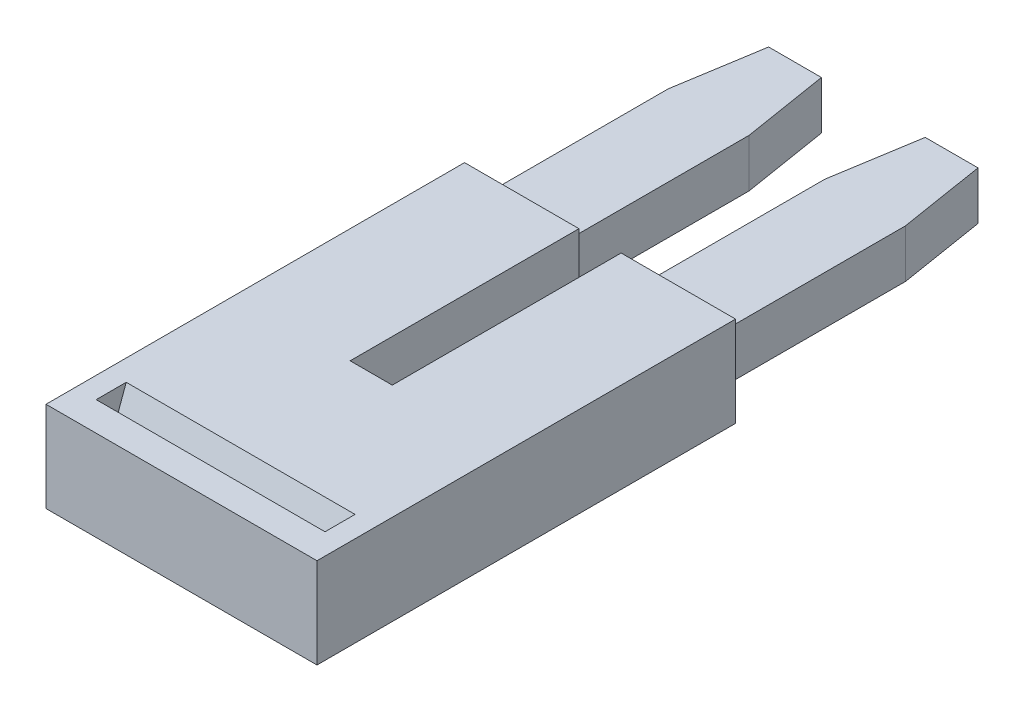
ISO-10303-21;
HEADER;
FILE_DESCRIPTION(('STEP AP214'),'2;1');
FILE_NAME('part.step','',(''),(''),'','','');
FILE_SCHEMA(('AUTOMOTIVE_DESIGN { 1 0 10303 214 1 1 1 1 }'));
ENDSEC;
DATA;
#1=APPLICATION_CONTEXT('core data for automotive mechanical design processes');
#2=APPLICATION_PROTOCOL_DEFINITION('international standard','automotive_design',2000,#1);
#3=PRODUCT_CONTEXT('',#1,'mechanical');
#4=PRODUCT('Part','Part','',(#3));
#5=PRODUCT_RELATED_PRODUCT_CATEGORY('part','',(#4));
#6=PRODUCT_DEFINITION_FORMATION('','',#4);
#7=PRODUCT_DEFINITION_CONTEXT('part definition',#1,'design');
#8=PRODUCT_DEFINITION('design','',#6,#7);
#9=PRODUCT_DEFINITION_SHAPE('','',#8);
#10=(LENGTH_UNIT() NAMED_UNIT(*) SI_UNIT(.MILLI.,.METRE.));
#11=(NAMED_UNIT(*) PLANE_ANGLE_UNIT() SI_UNIT($,.RADIAN.));
#12=(NAMED_UNIT(*) SI_UNIT($,.STERADIAN.) SOLID_ANGLE_UNIT());
#13=UNCERTAINTY_MEASURE_WITH_UNIT(LENGTH_MEASURE(1.E-05),#10,'distance_accuracy_value','');
#14=(GEOMETRIC_REPRESENTATION_CONTEXT(3) GLOBAL_UNCERTAINTY_ASSIGNED_CONTEXT((#13)) GLOBAL_UNIT_ASSIGNED_CONTEXT((#10,
#11,#12)) REPRESENTATION_CONTEXT('',''));
#15=CARTESIAN_POINT('',(0.,0.,0.));
#16=DIRECTION('',(0.,0.,1.));
#17=DIRECTION('',(1.,0.,0.));
#18=AXIS2_PLACEMENT_3D('',#15,#16,#17);
#19=CARTESIAN_POINT('',(-1.4200024,1.,21.3750000022971));
#20=DIRECTION('',(0.,0.342020143325669,-0.939692620785908));
#21=DIRECTION('',(-1.,0.,0.));
#22=AXIS2_PLACEMENT_3D('',#19,#20,#21);
#23=PLANE('',#22);
#24=DIRECTION('',(1.,0.,0.));
#25=VECTOR('',#24,1.);
#26=CARTESIAN_POINT('',(11.2850159999987,1.,21.3750000022971));
#27=LINE('',#26,#25);
#28=CARTESIAN_POINT('',(0.7,1.,21.3750000022971));
#29=VERTEX_POINT('',#28);
#30=CARTESIAN_POINT('',(8.3,1.,21.3750000022971));
#31=VERTEX_POINT('',#30);
#32=EDGE_CURVE('E11',#29,#31,#27,.T.);
#33=ORIENTED_EDGE('',*,*,#32,.F.);
#34=DIRECTION('',(0.,-0.939692620785908,-0.342020143325669));
#35=VECTOR('',#34,1.);
#36=CARTESIAN_POINT('',(0.7,0.,21.0110297680308));
#37=LINE('',#36,#35);
#38=CARTESIAN_POINT('',(0.7,0.,21.0110297680308));
#39=VERTEX_POINT('',#38);
#40=EDGE_CURVE('E367',#29,#39,#37,.T.);
#41=ORIENTED_EDGE('',*,*,#40,.T.);
#42=DIRECTION('',(-1.,0.,0.));
#43=VECTOR('',#42,1.);
#44=CARTESIAN_POINT('',(-2.2850159999988,0.,21.0110297680308));
#45=LINE('',#44,#43);
#46=CARTESIAN_POINT('',(8.3,0.,21.0110297680308));
#47=VERTEX_POINT('',#46);
#48=EDGE_CURVE('E392',#47,#39,#45,.T.);
#49=ORIENTED_EDGE('',*,*,#48,.F.);
#50=DIRECTION('',(0.,-0.939692620785908,-0.342020143325669));
#51=VECTOR('',#50,1.);
#52=CARTESIAN_POINT('',(8.3,0.,21.0110297680308));
#53=LINE('',#52,#51);
#54=EDGE_CURVE('E514',#31,#47,#53,.T.);
#55=ORIENTED_EDGE('',*,*,#54,.F.);
#56=EDGE_LOOP('',(#33,#41,#49,#55));
#57=FACE_BOUND('',#56,.T.);
#58=ADVANCED_FACE('F17',(#57),#23,.F.);
#59=CARTESIAN_POINT('',(3.7799976,1.,21.7410254060815));
#60=DIRECTION('',(0.,1.,0.));
#61=DIRECTION('',(0.,0.,1.));
#62=AXIS2_PLACEMENT_3D('',#59,#60,#61);
#63=PLANE('',#62);
#64=DIRECTION('',(1.,0.,0.));
#65=VECTOR('',#64,1.);
#66=CARTESIAN_POINT('',(11.2850159999987,1.,21.7410254060815));
#67=LINE('',#66,#65);
#68=CARTESIAN_POINT('',(0.7,1.,21.7410254060815));
#69=VERTEX_POINT('',#68);
#70=CARTESIAN_POINT('',(8.3,1.,21.7410254060815));
#71=VERTEX_POINT('',#70);
#72=EDGE_CURVE('E341',#69,#71,#67,.T.);
#73=ORIENTED_EDGE('',*,*,#72,.F.);
#74=DIRECTION('',(0.,0.,1.));
#75=VECTOR('',#74,1.);
#76=CARTESIAN_POINT('',(0.7,0.999999999999986,19.5448760022974));
#77=LINE('',#76,#75);
#78=EDGE_CURVE('E28',#29,#69,#77,.T.);
#79=ORIENTED_EDGE('',*,*,#78,.F.);
#80=ORIENTED_EDGE('',*,*,#32,.T.);
#81=DIRECTION('',(0.,0.,-1.));
#82=VECTOR('',#81,1.);
#83=CARTESIAN_POINT('',(8.3,0.999999999999985,19.5448760022974));
#84=LINE('',#83,#82);
#85=EDGE_CURVE('E418',#71,#31,#84,.T.);
#86=ORIENTED_EDGE('',*,*,#85,.F.);
#87=EDGE_LOOP('',(#73,#79,#80,#86));
#88=FACE_BOUND('',#87,.T.);
#89=ADVANCED_FACE('F597',(#88),#63,.F.);
#90=CARTESIAN_POINT('',(0.7,0.905897704359139,16.548236049703));
#91=DIRECTION('',(-1.,0.,0.));
#92=DIRECTION('',(0.,-1.,1.26010313294955E-13));
#93=AXIS2_PLACEMENT_3D('',#90,#91,#92);
#94=PLANE('',#93);
#95=ORIENTED_EDGE('',*,*,#40,.F.);
#96=ORIENTED_EDGE('',*,*,#78,.T.);
#97=DIRECTION('',(0.,0.965925826289069,-0.25881904510252));
#98=VECTOR('',#97,1.);
#99=CARTESIAN_POINT('',(0.7,0.,22.0089745985125));
#100=LINE('',#99,#98);
#101=CARTESIAN_POINT('',(0.7,0.,22.0089745985125));
#102=VERTEX_POINT('',#101);
#103=EDGE_CURVE('E331',#102,#69,#100,.T.);
#104=ORIENTED_EDGE('',*,*,#103,.F.);
#105=DIRECTION('',(0.,0.,1.));
#106=VECTOR('',#105,1.);
#107=CARTESIAN_POINT('',(0.7,0.,19.8448760022976));
#108=LINE('',#107,#106);
#109=EDGE_CURVE('E384',#39,#102,#108,.T.);
#110=ORIENTED_EDGE('',*,*,#109,.F.);
#111=EDGE_LOOP('',(#95,#96,#104,#110));
#112=FACE_BOUND('',#111,.T.);
#113=ADVANCED_FACE('F19',(#112),#94,.F.);
#114=CARTESIAN_POINT('',(8.3,1.61850495487346,14.0928490765419));
#115=DIRECTION('',(1.,0.,0.));
#116=DIRECTION('',(0.,1.,-1.26010313294955E-13));
#117=AXIS2_PLACEMENT_3D('',#114,#115,#116);
#118=PLANE('',#117);
#119=DIRECTION('',(0.,-0.965925826289069,0.25881904510252));
#120=VECTOR('',#119,1.);
#121=CARTESIAN_POINT('',(8.3,0.,22.0089745985125));
#122=LINE('',#121,#120);
#123=CARTESIAN_POINT('',(8.3,0.,22.0089745985125));
#124=VERTEX_POINT('',#123);
#125=EDGE_CURVE('E416',#71,#124,#122,.T.);
#126=ORIENTED_EDGE('',*,*,#125,.F.);
#127=ORIENTED_EDGE('',*,*,#85,.T.);
#128=ORIENTED_EDGE('',*,*,#54,.T.);
#129=DIRECTION('',(0.,0.,-1.));
#130=VECTOR('',#129,1.);
#131=CARTESIAN_POINT('',(8.3,0.,19.8448760022976));
#132=LINE('',#131,#130);
#133=EDGE_CURVE('E383',#124,#47,#132,.T.);
#134=ORIENTED_EDGE('',*,*,#133,.F.);
#135=EDGE_LOOP('',(#126,#127,#128,#134));
#136=FACE_BOUND('',#135,.T.);
#137=ADVANCED_FACE('F635',(#136),#118,.F.);
#138=CARTESIAN_POINT('',(-1.4200024,0.5,21.875000002297));
#139=DIRECTION('',(0.,0.25881904510252,0.965925826289069));
#140=DIRECTION('',(-1.,0.,0.));
#141=AXIS2_PLACEMENT_3D('',#138,#139,#140);
#142=PLANE('',#141);
#143=ORIENTED_EDGE('',*,*,#103,.T.);
#144=ORIENTED_EDGE('',*,*,#72,.T.);
#145=ORIENTED_EDGE('',*,*,#125,.T.);
#146=DIRECTION('',(1.,0.,0.));
#147=VECTOR('',#146,1.);
#148=CARTESIAN_POINT('',(-2.2850159999988,0.,22.0089745985125));
#149=LINE('',#148,#147);
#150=EDGE_CURVE('E380',#102,#124,#149,.T.);
#151=ORIENTED_EDGE('',*,*,#150,.F.);
#152=EDGE_LOOP('',(#143,#144,#145,#151));
#153=FACE_BOUND('',#152,.T.);
#154=ADVANCED_FACE('F638',(#153),#142,.F.);
#155=CARTESIAN_POINT('',(8.3,1.61850495487346,14.0928490765419));
#156=DIRECTION('',(1.,0.,0.));
#157=DIRECTION('',(0.,1.,-1.26010313294955E-13));
#158=AXIS2_PLACEMENT_3D('',#155,#156,#157);
#159=PLANE('',#158);
#160=DIRECTION('',(0.,0.939692620785908,-0.342020143325669));
#161=VECTOR('',#160,1.);
#162=CARTESIAN_POINT('',(8.3,0.,22.1029404708293));
#163=LINE('',#162,#161);
#164=CARTESIAN_POINT('',(8.3,2.,21.375000002297));
#165=VERTEX_POINT('',#164);
#166=CARTESIAN_POINT('',(8.3,3.,21.0110297680308));
#167=VERTEX_POINT('',#166);
#168=EDGE_CURVE('E318',#165,#167,#163,.T.);
#169=ORIENTED_EDGE('',*,*,#168,.F.);
#170=DIRECTION('',(0.,0.,1.));
#171=VECTOR('',#170,1.);
#172=CARTESIAN_POINT('',(8.3,2.,19.5448760022974));
#173=LINE('',#172,#171);
#174=CARTESIAN_POINT('',(8.3,2.,21.7410254060814));
#175=VERTEX_POINT('',#174);
#176=EDGE_CURVE('E328',#165,#175,#173,.T.);
#177=ORIENTED_EDGE('',*,*,#176,.T.);
#178=DIRECTION('',(0.,-0.965925826289069,-0.25881904510252));
#179=VECTOR('',#178,1.);
#180=CARTESIAN_POINT('',(8.3,0.,21.2051270212191));
#181=LINE('',#180,#179);
#182=CARTESIAN_POINT('',(8.3,3.,22.0089745985126));
#183=VERTEX_POINT('',#182);
#184=EDGE_CURVE('E313',#183,#175,#181,.T.);
#185=ORIENTED_EDGE('',*,*,#184,.F.);
#186=DIRECTION('',(0.,0.,-1.));
#187=VECTOR('',#186,1.);
#188=CARTESIAN_POINT('',(8.3,3.,19.8448760022972));
#189=LINE('',#188,#187);
#190=EDGE_CURVE('E332',#183,#167,#189,.T.);
#191=ORIENTED_EDGE('',*,*,#190,.T.);
#192=EDGE_LOOP('',(#169,#177,#185,#191));
#193=FACE_BOUND('',#192,.T.);
#194=ADVANCED_FACE('F963',(#193),#159,.F.);
#195=CARTESIAN_POINT('',(-6.6200024,2.,21.6094970022974));
#196=DIRECTION('',(0.,-1.,0.));
#197=DIRECTION('',(0.,0.,1.));
#198=AXIS2_PLACEMENT_3D('',#195,#196,#197);
#199=PLANE('',#198);
#200=DIRECTION('',(-1.,0.,0.));
#201=VECTOR('',#200,1.);
#202=CARTESIAN_POINT('',(11.2850159999987,2.,21.7410254060814));
#203=LINE('',#202,#201);
#204=CARTESIAN_POINT('',(0.7,2.,21.7410254060814));
#205=VERTEX_POINT('',#204);
#206=EDGE_CURVE('E317',#175,#205,#203,.T.);
#207=ORIENTED_EDGE('',*,*,#206,.F.);
#208=ORIENTED_EDGE('',*,*,#176,.F.);
#209=DIRECTION('',(-1.,0.,0.));
#210=VECTOR('',#209,1.);
#211=CARTESIAN_POINT('',(11.2850159999987,2.,21.375000002297));
#212=LINE('',#211,#210);
#213=CARTESIAN_POINT('',(0.7,2.,21.375000002297));
#214=VERTEX_POINT('',#213);
#215=EDGE_CURVE('E324',#165,#214,#212,.T.);
#216=ORIENTED_EDGE('',*,*,#215,.T.);
#217=DIRECTION('',(0.,0.,1.));
#218=VECTOR('',#217,1.);
#219=CARTESIAN_POINT('',(0.7,2.,19.5448760022974));
#220=LINE('',#219,#218);
#221=EDGE_CURVE('E500',#214,#205,#220,.T.);
#222=ORIENTED_EDGE('',*,*,#221,.T.);
#223=EDGE_LOOP('',(#207,#208,#216,#222));
#224=FACE_BOUND('',#223,.T.);
#225=ADVANCED_FACE('F973',(#224),#199,.F.);
#226=CARTESIAN_POINT('',(7.7799976,2.,21.7410254060814));
#227=DIRECTION('',(0.,-0.25881904510252,0.965925826289069));
#228=DIRECTION('',(1.,0.,0.));
#229=AXIS2_PLACEMENT_3D('',#226,#227,#228);
#230=PLANE('',#229);
#231=DIRECTION('',(0.,0.965925826289069,0.25881904510252));
#232=VECTOR('',#231,1.);
#233=CARTESIAN_POINT('',(0.7,0.,21.2051270212191));
#234=LINE('',#233,#232);
#235=CARTESIAN_POINT('',(0.7,3.,22.0089745985126));
#236=VERTEX_POINT('',#235);
#237=EDGE_CURVE('E311',#205,#236,#234,.T.);
#238=ORIENTED_EDGE('',*,*,#237,.T.);
#239=DIRECTION('',(1.,0.,0.));
#240=VECTOR('',#239,1.);
#241=CARTESIAN_POINT('',(-2.2850159999988,3.,22.0089745985126));
#242=LINE('',#241,#240);
#243=EDGE_CURVE('E336',#236,#183,#242,.T.);
#244=ORIENTED_EDGE('',*,*,#243,.T.);
#245=ORIENTED_EDGE('',*,*,#184,.T.);
#246=ORIENTED_EDGE('',*,*,#206,.T.);
#247=EDGE_LOOP('',(#238,#244,#245,#246));
#248=FACE_BOUND('',#247,.T.);
#249=ADVANCED_FACE('F605',(#248),#230,.F.);
#250=CARTESIAN_POINT('',(3.7799976,3.42381598447616,20.8567733648752));
#251=DIRECTION('',(0.,-0.342020143325669,-0.939692620785908));
#252=DIRECTION('',(0.,-0.939692620785908,0.342020143325669));
#253=AXIS2_PLACEMENT_3D('',#250,#251,#252);
#254=PLANE('',#253);
#255=DIRECTION('',(-1.,0.,0.));
#256=VECTOR('',#255,1.);
#257=CARTESIAN_POINT('',(-2.2850159999988,3.,21.0110297680308));
#258=LINE('',#257,#256);
#259=CARTESIAN_POINT('',(0.7,3.,21.0110297680308));
#260=VERTEX_POINT('',#259);
#261=EDGE_CURVE('E372',#167,#260,#258,.T.);
#262=ORIENTED_EDGE('',*,*,#261,.T.);
#263=DIRECTION('',(0.,-0.939692620785908,0.342020143325669));
#264=VECTOR('',#263,1.);
#265=CARTESIAN_POINT('',(0.7,0.,22.1029404708293));
#266=LINE('',#265,#264);
#267=EDGE_CURVE('E327',#260,#214,#266,.T.);
#268=ORIENTED_EDGE('',*,*,#267,.T.);
#269=ORIENTED_EDGE('',*,*,#215,.F.);
#270=ORIENTED_EDGE('',*,*,#168,.T.);
#271=EDGE_LOOP('',(#262,#268,#269,#270));
#272=FACE_BOUND('',#271,.T.);
#273=ADVANCED_FACE('F630',(#272),#254,.F.);
#274=CARTESIAN_POINT('',(0.7,7.05810522166591,22.675000002297));
#275=DIRECTION('',(-1.,0.,0.));
#276=DIRECTION('',(0.,-1.,1.26010313294955E-13));
#277=AXIS2_PLACEMENT_3D('',#274,#275,#276);
#278=PLANE('',#277);
#279=ORIENTED_EDGE('',*,*,#237,.F.);
#280=ORIENTED_EDGE('',*,*,#221,.F.);
#281=ORIENTED_EDGE('',*,*,#267,.F.);
#282=DIRECTION('',(0.,0.,1.));
#283=VECTOR('',#282,1.);
#284=CARTESIAN_POINT('',(0.7,3.,19.8448760022972));
#285=LINE('',#284,#283);
#286=EDGE_CURVE('E368',#260,#236,#285,.T.);
#287=ORIENTED_EDGE('',*,*,#286,.T.);
#288=EDGE_LOOP('',(#279,#280,#281,#287));
#289=FACE_BOUND('',#288,.T.);
#290=ADVANCED_FACE('F633',(#289),#278,.F.);
#291=CARTESIAN_POINT('',(2.3510536313107,0.699999999990223,-2.20268248085631E-13));
#292=DIRECTION('',(-1.44485161757993E-13,0.,1.));
#293=DIRECTION('',(-1.,0.,-1.44485161757993E-13));
#294=AXIS2_PLACEMENT_3D('',#291,#292,#293);
#295=PLANE('',#294);
#296=DIRECTION('',(0.,-1.,0.));
#297=VECTOR('',#296,1.);
#298=CARTESIAN_POINT('',(1.0231890513662,0.699999999990223,-4.19220214098459E-13));
#299=LINE('',#298,#297);
#300=CARTESIAN_POINT('',(1.0231890513662,2.29999999999022,-4.19220214098459E-13));
#301=VERTEX_POINT('',#300);
#302=CARTESIAN_POINT('',(1.0231890513662,0.699999999990223,-4.19220214098459E-13));
#303=VERTEX_POINT('',#302);
#304=EDGE_CURVE('E308',#301,#303,#299,.T.);
#305=ORIENTED_EDGE('',*,*,#304,.F.);
#306=DIRECTION('',(1.,0.,1.44485161757993E-13));
#307=VECTOR('',#306,1.);
#308=CARTESIAN_POINT('',(4.1002658398157,2.29999999999022,2.29208296786964E-09));
#309=LINE('',#308,#307);
#310=CARTESIAN_POINT('',(2.7768109480402,2.29999999999022,-2.20268248085631E-13));
#311=VERTEX_POINT('',#310);
#312=EDGE_CURVE('E307',#301,#311,#309,.T.);
#313=ORIENTED_EDGE('',*,*,#312,.T.);
#314=DIRECTION('',(0.,-1.,0.));
#315=VECTOR('',#314,1.);
#316=CARTESIAN_POINT('',(2.7768109480402,0.699999999990223,-2.20268248085631E-13));
#317=LINE('',#316,#315);
#318=CARTESIAN_POINT('',(2.7768109480402,0.699999999990223,-2.20268248085631E-13));
#319=VERTEX_POINT('',#318);
#320=EDGE_CURVE('E312',#311,#319,#317,.T.);
#321=ORIENTED_EDGE('',*,*,#320,.T.);
#322=DIRECTION('',(1.,0.,1.44485161757993E-13));
#323=VECTOR('',#322,1.);
#324=CARTESIAN_POINT('',(4.1002658398157,0.699999999990223,2.29208296786964E-09));
#325=LINE('',#324,#323);
#326=EDGE_CURVE('E408',#303,#319,#325,.T.);
#327=ORIENTED_EDGE('',*,*,#326,.F.);
#328=EDGE_LOOP('',(#305,#313,#321,#327));
#329=FACE_BOUND('',#328,.T.);
#330=ADVANCED_FACE('F578',(#329),#295,.F.);
#331=CARTESIAN_POINT('',(0.955336778672901,0.699999999990226,0.420315790585686));
#332=DIRECTION('',(0.987219178105449,0.,0.159368423411923));
#333=DIRECTION('',(0.,1.,0.));
#334=AXIS2_PLACEMENT_3D('',#331,#332,#333);
#335=PLANE('',#334);
#336=DIRECTION('',(0.,1.,0.));
#337=VECTOR('',#336,1.);
#338=CARTESIAN_POINT('',(0.559999999037899,2.9999999999982,2.8692579480757));
#339=LINE('',#338,#337);
#340=CARTESIAN_POINT('',(0.559999999037899,0.699999999990225,2.86925794807569));
#341=VERTEX_POINT('',#340);
#342=CARTESIAN_POINT('',(0.559999999037899,2.29999999999022,2.86925794807568));
#343=VERTEX_POINT('',#342);
#344=EDGE_CURVE('E360',#341,#343,#339,.T.);
#345=ORIENTED_EDGE('',*,*,#344,.T.);
#346=DIRECTION('',(-0.159368423411923,0.,0.987219178105449));
#347=VECTOR('',#346,1.);
#348=CARTESIAN_POINT('',(-2.1804020775669,2.29999999999022,19.8448760022973));
#349=LINE('',#348,#347);
#350=EDGE_CURVE('E435',#301,#343,#349,.T.);
#351=ORIENTED_EDGE('',*,*,#350,.F.);
#352=ORIENTED_EDGE('',*,*,#304,.T.);
#353=DIRECTION('',(-0.159368423411923,0.,0.987219178105449));
#354=VECTOR('',#353,1.);
#355=CARTESIAN_POINT('',(-2.180402077567,0.699999999990224,19.8448760022975));
#356=LINE('',#355,#354);
#357=EDGE_CURVE('E413',#303,#341,#356,.T.);
#358=ORIENTED_EDGE('',*,*,#357,.T.);
#359=EDGE_LOOP('',(#345,#351,#352,#358));
#360=FACE_BOUND('',#359,.T.);
#361=ADVANCED_FACE('F575',(#360),#335,.F.);
#362=CARTESIAN_POINT('',(7.5510536313107,0.699999999990213,4.83169060316868E-13));
#363=DIRECTION('',(-1.44485161757993E-13,0.,1.));
#364=DIRECTION('',(-1.,0.,-1.44485161757993E-13));
#365=AXIS2_PLACEMENT_3D('',#362,#363,#364);
#366=PLANE('',#365);
#367=DIRECTION('',(0.,-1.,0.));
#368=VECTOR('',#367,1.);
#369=CARTESIAN_POINT('',(6.223189051366,0.699999999990223,2.8421709430404E-13));
#370=LINE('',#369,#368);
#371=CARTESIAN_POINT('',(6.223189051366,2.29999999999022,2.8421709430404E-13));
#372=VERTEX_POINT('',#371);
#373=CARTESIAN_POINT('',(6.223189051366,0.699999999990223,2.8421709430404E-13));
#374=VERTEX_POINT('',#373);
#375=EDGE_CURVE('E432',#372,#374,#370,.T.);
#376=ORIENTED_EDGE('',*,*,#375,.F.);
#377=DIRECTION('',(1.,0.,1.44485161757993E-13));
#378=VECTOR('',#377,1.);
#379=CARTESIAN_POINT('',(9.3002658398157,2.29999999999021,2.29128005457824E-09));
#380=LINE('',#379,#378);
#381=CARTESIAN_POINT('',(7.9768109480402,2.29999999999021,4.83169060316868E-13));
#382=VERTEX_POINT('',#381);
#383=EDGE_CURVE('E322',#372,#382,#380,.T.);
#384=ORIENTED_EDGE('',*,*,#383,.T.);
#385=DIRECTION('',(0.,-1.,0.));
#386=VECTOR('',#385,1.);
#387=CARTESIAN_POINT('',(7.9768109480402,0.699999999990213,5.82645043323282E-13));
#388=LINE('',#387,#386);
#389=CARTESIAN_POINT('',(7.9768109480402,0.699999999990213,4.83169060316868E-13));
#390=VERTEX_POINT('',#389);
#391=EDGE_CURVE('E364',#382,#390,#388,.T.);
#392=ORIENTED_EDGE('',*,*,#391,.T.);
#393=DIRECTION('',(1.,0.,1.44485161757993E-13));
#394=VECTOR('',#393,1.);
#395=CARTESIAN_POINT('',(9.3002658398157,0.699999999990212,2.29128005457824E-09));
#396=LINE('',#395,#394);
#397=EDGE_CURVE('E510',#374,#390,#396,.T.);
#398=ORIENTED_EDGE('',*,*,#397,.F.);
#399=EDGE_LOOP('',(#376,#384,#392,#398));
#400=FACE_BOUND('',#399,.T.);
#401=ADVANCED_FACE('F584',(#400),#366,.F.);
#402=CARTESIAN_POINT('',(3.2274438346573,0.699999999990225,2.79147787515869));
#403=DIRECTION('',(-0.987219178105449,0.,0.159368423411924));
#404=DIRECTION('',(0.,-1.,1.26010313294955E-13));
#405=AXIS2_PLACEMENT_3D('',#402,#403,#404);
#406=PLANE('',#405);
#407=ORIENTED_EDGE('',*,*,#320,.F.);
#408=DIRECTION('',(0.159368423411924,0.,0.987219178105449));
#409=VECTOR('',#408,1.);
#410=CARTESIAN_POINT('',(5.9804020769734,2.29999999999022,19.8448760022973));
#411=LINE('',#410,#409);
#412=CARTESIAN_POINT('',(3.2399999987973,2.29999999999022,2.86925793834238));
#413=VERTEX_POINT('',#412);
#414=EDGE_CURVE('E304',#311,#413,#411,.T.);
#415=ORIENTED_EDGE('',*,*,#414,.T.);
#416=DIRECTION('',(0.,-1.,0.));
#417=VECTOR('',#416,1.);
#418=CARTESIAN_POINT('',(3.2399999987973,2.9999999999982,2.86925793834239));
#419=LINE('',#418,#417);
#420=CARTESIAN_POINT('',(3.2399999987973,0.699999999990225,2.86925793834238));
#421=VERTEX_POINT('',#420);
#422=EDGE_CURVE('E266',#413,#421,#419,.T.);
#423=ORIENTED_EDGE('',*,*,#422,.T.);
#424=DIRECTION('',(0.159368423411924,0.,0.987219178105449));
#425=VECTOR('',#424,1.);
#426=CARTESIAN_POINT('',(5.9804020769734,0.699999999990223,19.8448760022975));
#427=LINE('',#426,#425);
#428=EDGE_CURVE('E412',#319,#421,#427,.T.);
#429=ORIENTED_EDGE('',*,*,#428,.F.);
#430=EDGE_LOOP('',(#407,#415,#423,#429));
#431=FACE_BOUND('',#430,.T.);
#432=ADVANCED_FACE('F582',(#431),#406,.F.);
#433=CARTESIAN_POINT('',(4.4999999999997,0.699999999990221,18.8750000022962));
#434=DIRECTION('',(0.,-1.,0.));
#435=DIRECTION('',(0.,0.,1.));
#436=AXIS2_PLACEMENT_3D('',#433,#434,#435);
#437=PLANE('',#436);
#438=DIRECTION('',(-1.44925274306014E-13,0.,1.));
#439=VECTOR('',#438,1.);
#440=CARTESIAN_POINT('',(0.559999999035398,0.699999999990224,19.8448760022975));
#441=LINE('',#440,#439);
#442=CARTESIAN_POINT('',(0.559999999037004,0.699999999990227,9.07500000229699));
#443=VERTEX_POINT('',#442);
#444=EDGE_CURVE('E363',#341,#443,#441,.T.);
#445=ORIENTED_EDGE('',*,*,#444,.F.);
#446=ORIENTED_EDGE('',*,*,#357,.F.);
#447=ORIENTED_EDGE('',*,*,#326,.T.);
#448=ORIENTED_EDGE('',*,*,#428,.T.);
#449=DIRECTION('',(0.,0.,-1.));
#450=VECTOR('',#449,1.);
#451=CARTESIAN_POINT('',(3.2399999987973,0.699999999990224,19.8448760022975));
#452=LINE('',#451,#450);
#453=CARTESIAN_POINT('',(3.2399999987973,0.699999999990217,9.07500000229699));
#454=VERTEX_POINT('',#453);
#455=EDGE_CURVE('E271',#454,#421,#452,.T.);
#456=ORIENTED_EDGE('',*,*,#455,.F.);
#457=DIRECTION('',(-1.,0.,0.));
#458=VECTOR('',#457,1.);
#459=CARTESIAN_POINT('',(-2.2850159999988,0.699999999990227,9.07500000229699));
#460=LINE('',#459,#458);
#461=EDGE_CURVE('E280',#454,#443,#460,.T.);
#462=ORIENTED_EDGE('',*,*,#461,.T.);
#463=EDGE_LOOP('',(#445,#446,#447,#448,#456,#462));
#464=FACE_BOUND('',#463,.T.);
#465=ADVANCED_FACE('F568',(#464),#437,.T.);
#466=CARTESIAN_POINT('',(0.559999999037103,0.699999999990224,8.17500068365479));
#467=DIRECTION('',(1.,0.,1.44925274306014E-13));
#468=DIRECTION('',(1.44925274306014E-13,-1.26010313294955E-13,-1.));
#469=AXIS2_PLACEMENT_3D('',#466,#467,#468);
#470=PLANE('',#469);
#471=DIRECTION('',(-1.44925274306014E-13,0.,1.));
#472=VECTOR('',#471,1.);
#473=CARTESIAN_POINT('',(0.559999999035398,2.29999999999022,19.8448760022973));
#474=LINE('',#473,#472);
#475=CARTESIAN_POINT('',(0.559999999037004,2.29999999999023,9.07500000229698));
#476=VERTEX_POINT('',#475);
#477=EDGE_CURVE('E287',#343,#476,#474,.T.);
#478=ORIENTED_EDGE('',*,*,#477,.F.);
#479=ORIENTED_EDGE('',*,*,#344,.F.);
#480=ORIENTED_EDGE('',*,*,#444,.T.);
#481=DIRECTION('',(0.,-1.,0.));
#482=VECTOR('',#481,1.);
#483=CARTESIAN_POINT('',(0.559999999037004,2.99999999999899,9.075000002297));
#484=LINE('',#483,#482);
#485=EDGE_CURVE('E290',#476,#443,#484,.T.);
#486=ORIENTED_EDGE('',*,*,#485,.F.);
#487=EDGE_LOOP('',(#478,#479,#480,#486));
#488=FACE_BOUND('',#487,.T.);
#489=ADVANCED_FACE('F572',(#488),#470,.F.);
#490=CARTESIAN_POINT('',(5.7599999990371,0.569997599988239,-0.899867999993298));
#491=DIRECTION('',(1.,0.,0.));
#492=DIRECTION('',(0.,1.,-1.26010313294955E-13));
#493=AXIS2_PLACEMENT_3D('',#490,#491,#492);
#494=PLANE('',#493);
#495=DIRECTION('',(0.,-1.,0.));
#496=VECTOR('',#495,1.);
#497=CARTESIAN_POINT('',(5.7599999990371,2.99999999999899,9.075000002297));
#498=LINE('',#497,#496);
#499=CARTESIAN_POINT('',(5.7599999990371,2.29999999999021,9.07500000229698));
#500=VERTEX_POINT('',#499);
#501=CARTESIAN_POINT('',(5.7599999990371,0.699999999990216,9.07500000229699));
#502=VERTEX_POINT('',#501);
#503=EDGE_CURVE('E359',#500,#502,#498,.T.);
#504=ORIENTED_EDGE('',*,*,#503,.F.);
#505=DIRECTION('',(0.,0.,1.));
#506=VECTOR('',#505,1.);
#507=CARTESIAN_POINT('',(5.7599999990371,2.29999999999022,19.8448760022973));
#508=LINE('',#507,#506);
#509=CARTESIAN_POINT('',(5.7599999990371,2.29999999999021,2.86925794807968));
#510=VERTEX_POINT('',#509);
#511=EDGE_CURVE('E515',#510,#500,#508,.T.);
#512=ORIENTED_EDGE('',*,*,#511,.F.);
#513=DIRECTION('',(0.,1.,0.));
#514=VECTOR('',#513,1.);
#515=CARTESIAN_POINT('',(5.7599999990371,2.9999999999982,2.86925794807969));
#516=LINE('',#515,#514);
#517=CARTESIAN_POINT('',(5.7599999990371,0.699999999990215,2.86925794807969));
#518=VERTEX_POINT('',#517);
#519=EDGE_CURVE('E354',#518,#510,#516,.T.);
#520=ORIENTED_EDGE('',*,*,#519,.F.);
#521=DIRECTION('',(0.,0.,1.));
#522=VECTOR('',#521,1.);
#523=CARTESIAN_POINT('',(5.7599999990371,0.699999999990223,19.8448760022975));
#524=LINE('',#523,#522);
#525=EDGE_CURVE('E443',#518,#502,#524,.T.);
#526=ORIENTED_EDGE('',*,*,#525,.T.);
#527=EDGE_LOOP('',(#504,#512,#520,#526));
#528=FACE_BOUND('',#527,.T.);
#529=ADVANCED_FACE('F613',(#528),#494,.F.);
#530=CARTESIAN_POINT('',(8.4274438346573,0.699999999990215,2.79147787515959));
#531=DIRECTION('',(-0.987219178105449,0.,0.159368423411924));
#532=DIRECTION('',(0.,-1.,1.26010313294955E-13));
#533=AXIS2_PLACEMENT_3D('',#530,#531,#532);
#534=PLANE('',#533);
#535=ORIENTED_EDGE('',*,*,#391,.F.);
#536=DIRECTION('',(0.159368423411924,0.,0.987219178105449));
#537=VECTOR('',#536,1.);
#538=CARTESIAN_POINT('',(11.1804020769732,2.29999999999021,19.8448760022973));
#539=LINE('',#538,#537);
#540=CARTESIAN_POINT('',(8.43999999903601,2.29999999999021,2.86925793982219));
#541=VERTEX_POINT('',#540);
#542=EDGE_CURVE('E319',#382,#541,#539,.T.);
#543=ORIENTED_EDGE('',*,*,#542,.T.);
#544=DIRECTION('',(0.,1.,0.));
#545=VECTOR('',#544,1.);
#546=CARTESIAN_POINT('',(8.43999999903601,2.9999999999982,2.86925793982219));
#547=LINE('',#546,#545);
#548=CARTESIAN_POINT('',(8.43999999903601,0.699999999990215,2.86925793982219));
#549=VERTEX_POINT('',#548);
#550=EDGE_CURVE('E323',#549,#541,#547,.T.);
#551=ORIENTED_EDGE('',*,*,#550,.F.);
#552=DIRECTION('',(0.159368423411924,0.,0.987219178105449));
#553=VECTOR('',#552,1.);
#554=CARTESIAN_POINT('',(11.1804020769733,0.699999999990213,19.8448760022975));
#555=LINE('',#554,#553);
#556=EDGE_CURVE('E301',#390,#549,#555,.T.);
#557=ORIENTED_EDGE('',*,*,#556,.F.);
#558=EDGE_LOOP('',(#535,#543,#551,#557));
#559=FACE_BOUND('',#558,.T.);
#560=ADVANCED_FACE('F616',(#559),#534,.F.);
#561=CARTESIAN_POINT('',(4.4999999999997,2.29999999999022,18.8750000022962));
#562=DIRECTION('',(0.,-1.,0.));
#563=DIRECTION('',(0.,0.,1.));
#564=AXIS2_PLACEMENT_3D('',#561,#562,#563);
#565=PLANE('',#564);
#566=DIRECTION('',(-1.,0.,0.));
#567=VECTOR('',#566,1.);
#568=CARTESIAN_POINT('',(-2.2850159999988,2.29999999999023,9.07500000229698));
#569=LINE('',#568,#567);
#570=CARTESIAN_POINT('',(8.43999999903601,2.29999999999021,9.07500000229698));
#571=VERTEX_POINT('',#570);
#572=EDGE_CURVE('E373',#571,#500,#569,.T.);
#573=ORIENTED_EDGE('',*,*,#572,.F.);
#574=DIRECTION('',(0.,0.,1.));
#575=VECTOR('',#574,1.);
#576=CARTESIAN_POINT('',(8.43999999903601,2.29999999999021,19.8448760022973));
#577=LINE('',#576,#575);
#578=EDGE_CURVE('E494',#541,#571,#577,.T.);
#579=ORIENTED_EDGE('',*,*,#578,.F.);
#580=ORIENTED_EDGE('',*,*,#542,.F.);
#581=ORIENTED_EDGE('',*,*,#383,.F.);
#582=DIRECTION('',(-0.159368423411923,0.,0.987219178105449));
#583=VECTOR('',#582,1.);
#584=CARTESIAN_POINT('',(3.0195979224329,2.29999999999022,19.8448760022973));
#585=LINE('',#584,#583);
#586=EDGE_CURVE('E358',#372,#510,#585,.T.);
#587=ORIENTED_EDGE('',*,*,#586,.T.);
#588=ORIENTED_EDGE('',*,*,#511,.T.);
#589=EDGE_LOOP('',(#573,#579,#580,#581,#587,#588));
#590=FACE_BOUND('',#589,.T.);
#591=ADVANCED_FACE('F644',(#590),#565,.F.);
#592=CARTESIAN_POINT('',(8.43999999903601,0.700000000008939,14.1750000000331));
#593=DIRECTION('',(1.,0.,0.));
#594=DIRECTION('',(0.,-1.26010313294955E-13,-1.));
#595=AXIS2_PLACEMENT_3D('',#592,#593,#594);
#596=PLANE('',#595);
#597=ORIENTED_EDGE('',*,*,#578,.T.);
#598=DIRECTION('',(0.,-1.,0.));
#599=VECTOR('',#598,1.);
#600=CARTESIAN_POINT('',(8.43999999903601,2.99999999999899,9.075000002297));
#601=LINE('',#600,#599);
#602=CARTESIAN_POINT('',(8.43999999903601,0.699999999990216,9.07500000229699));
#603=VERTEX_POINT('',#602);
#604=EDGE_CURVE('E377',#571,#603,#601,.T.);
#605=ORIENTED_EDGE('',*,*,#604,.T.);
#606=DIRECTION('',(0.,0.,1.));
#607=VECTOR('',#606,1.);
#608=CARTESIAN_POINT('',(8.43999999903601,0.699999999990213,19.8448760022975));
#609=LINE('',#608,#607);
#610=EDGE_CURVE('E491',#549,#603,#609,.T.);
#611=ORIENTED_EDGE('',*,*,#610,.F.);
#612=ORIENTED_EDGE('',*,*,#550,.T.);
#613=EDGE_LOOP('',(#597,#605,#611,#612));
#614=FACE_BOUND('',#613,.T.);
#615=ADVANCED_FACE('F624',(#614),#596,.T.);
#616=CARTESIAN_POINT('',(4.4999999999997,0.699999999990221,18.8750000022962));
#617=DIRECTION('',(0.,-1.,0.));
#618=DIRECTION('',(0.,0.,1.));
#619=AXIS2_PLACEMENT_3D('',#616,#617,#618);
#620=PLANE('',#619);
#621=DIRECTION('',(-1.,0.,0.));
#622=VECTOR('',#621,1.);
#623=CARTESIAN_POINT('',(-2.2850159999988,0.699999999990227,9.07500000229699));
#624=LINE('',#623,#622);
#625=EDGE_CURVE('E469',#603,#502,#624,.T.);
#626=ORIENTED_EDGE('',*,*,#625,.T.);
#627=ORIENTED_EDGE('',*,*,#525,.F.);
#628=DIRECTION('',(-0.159368423411923,0.,0.987219178105449));
#629=VECTOR('',#628,1.);
#630=CARTESIAN_POINT('',(3.0195979224329,0.699999999990224,19.8448760022975));
#631=LINE('',#630,#629);
#632=EDGE_CURVE('E21',#374,#518,#631,.T.);
#633=ORIENTED_EDGE('',*,*,#632,.F.);
#634=ORIENTED_EDGE('',*,*,#397,.T.);
#635=ORIENTED_EDGE('',*,*,#556,.T.);
#636=ORIENTED_EDGE('',*,*,#610,.T.);
#637=EDGE_LOOP('',(#626,#627,#633,#634,#635,#636));
#638=FACE_BOUND('',#637,.T.);
#639=ADVANCED_FACE('F621',(#638),#620,.T.);
#640=CARTESIAN_POINT('',(4.4999999999997,2.29999999999022,18.8750000022962));
#641=DIRECTION('',(0.,-1.,0.));
#642=DIRECTION('',(0.,0.,1.));
#643=AXIS2_PLACEMENT_3D('',#640,#641,#642);
#644=PLANE('',#643);
#645=ORIENTED_EDGE('',*,*,#477,.T.);
#646=DIRECTION('',(-1.,0.,0.));
#647=VECTOR('',#646,1.);
#648=CARTESIAN_POINT('',(-2.2850159999988,2.29999999999023,9.07500000229698));
#649=LINE('',#648,#647);
#650=CARTESIAN_POINT('',(3.2399999987973,2.29999999999021,9.07500000229698));
#651=VERTEX_POINT('',#650);
#652=EDGE_CURVE('E278',#651,#476,#649,.T.);
#653=ORIENTED_EDGE('',*,*,#652,.F.);
#654=DIRECTION('',(0.,0.,-1.));
#655=VECTOR('',#654,1.);
#656=CARTESIAN_POINT('',(3.2399999987973,2.29999999999022,19.8448760022973));
#657=LINE('',#656,#655);
#658=EDGE_CURVE('E259',#651,#413,#657,.T.);
#659=ORIENTED_EDGE('',*,*,#658,.T.);
#660=ORIENTED_EDGE('',*,*,#414,.F.);
#661=ORIENTED_EDGE('',*,*,#312,.F.);
#662=ORIENTED_EDGE('',*,*,#350,.T.);
#663=EDGE_LOOP('',(#645,#653,#659,#660,#661,#662));
#664=FACE_BOUND('',#663,.T.);
#665=ADVANCED_FACE('F284',(#664),#644,.F.);
#666=CARTESIAN_POINT('',(3.2399999987973,0.699999999990224,13.5750000021904));
#667=DIRECTION('',(-1.,0.,0.));
#668=DIRECTION('',(0.,-1.26010313294955E-13,-1.));
#669=AXIS2_PLACEMENT_3D('',#666,#667,#668);
#670=PLANE('',#669);
#671=ORIENTED_EDGE('',*,*,#658,.F.);
#672=DIRECTION('',(0.,1.,0.));
#673=VECTOR('',#672,1.);
#674=CARTESIAN_POINT('',(3.2399999987973,2.99999999999899,9.075000002297));
#675=LINE('',#674,#673);
#676=EDGE_CURVE('E263',#454,#651,#675,.T.);
#677=ORIENTED_EDGE('',*,*,#676,.F.);
#678=ORIENTED_EDGE('',*,*,#455,.T.);
#679=ORIENTED_EDGE('',*,*,#422,.F.);
#680=EDGE_LOOP('',(#671,#677,#678,#679));
#681=FACE_BOUND('',#680,.T.);
#682=ADVANCED_FACE('F261',(#681),#670,.F.);
#683=CARTESIAN_POINT('',(6.1553367786729,0.699999999990216,0.420315790584986));
#684=DIRECTION('',(0.987219178105449,0.,0.159368423411923));
#685=DIRECTION('',(0.,1.,0.));
#686=AXIS2_PLACEMENT_3D('',#683,#684,#685);
#687=PLANE('',#686);
#688=ORIENTED_EDGE('',*,*,#519,.T.);
#689=ORIENTED_EDGE('',*,*,#586,.F.);
#690=ORIENTED_EDGE('',*,*,#375,.T.);
#691=ORIENTED_EDGE('',*,*,#632,.T.);
#692=EDGE_LOOP('',(#688,#689,#690,#691));
#693=FACE_BOUND('',#692,.T.);
#694=ADVANCED_FACE('F629',(#693),#687,.F.);
#695=CARTESIAN_POINT('',(3.8,-0.616123089017418,23.9584930022974));
#696=DIRECTION('',(-1.,0.,0.));
#697=DIRECTION('',(0.,-1.,1.26010313294955E-13));
#698=AXIS2_PLACEMENT_3D('',#695,#696,#697);
#699=PLANE('',#698);
#700=DIRECTION('',(0.,1.,0.));
#701=VECTOR('',#700,1.);
#702=CARTESIAN_POINT('',(3.8,0.,9.07500000229697));
#703=LINE('',#702,#701);
#704=CARTESIAN_POINT('',(3.8,0.,9.07500000229697));
#705=VERTEX_POINT('',#704);
#706=CARTESIAN_POINT('',(3.8,3.,9.075000002297));
#707=VERTEX_POINT('',#706);
#708=EDGE_CURVE('E298',#705,#707,#703,.T.);
#709=ORIENTED_EDGE('',*,*,#708,.T.);
#710=DIRECTION('',(0.,0.,-1.));
#711=VECTOR('',#710,1.);
#712=CARTESIAN_POINT('',(3.8,3.,19.5448760022974));
#713=LINE('',#712,#711);
#714=CARTESIAN_POINT('',(3.8,3.,16.675000002297));
#715=VERTEX_POINT('',#714);
#716=EDGE_CURVE('E353',#715,#707,#713,.T.);
#717=ORIENTED_EDGE('',*,*,#716,.F.);
#718=DIRECTION('',(0.,-1.,0.));
#719=VECTOR('',#718,1.);
#720=CARTESIAN_POINT('',(3.8,0.,16.675000002297));
#721=LINE('',#720,#719);
#722=CARTESIAN_POINT('',(3.8,0.,16.675000002297));
#723=VERTEX_POINT('',#722);
#724=EDGE_CURVE('E347',#715,#723,#721,.T.);
#725=ORIENTED_EDGE('',*,*,#724,.T.);
#726=DIRECTION('',(0.,0.,-1.));
#727=VECTOR('',#726,1.);
#728=CARTESIAN_POINT('',(3.8,0.,19.5448760022974));
#729=LINE('',#728,#727);
#730=EDGE_CURVE('E422',#723,#705,#729,.T.);
#731=ORIENTED_EDGE('',*,*,#730,.T.);
#732=EDGE_LOOP('',(#709,#717,#725,#731));
#733=FACE_BOUND('',#732,.T.);
#734=ADVANCED_FACE('F829',(#733),#699,.F.);
#735=CARTESIAN_POINT('',(5.2,0.,16.675000002297));
#736=DIRECTION('',(-1.,0.,0.));
#737=DIRECTION('',(0.,-1.,1.26010313294955E-13));
#738=AXIS2_PLACEMENT_3D('',#735,#736,#737);
#739=PLANE('',#738);
#740=DIRECTION('',(0.,-1.,0.));
#741=VECTOR('',#740,1.);
#742=CARTESIAN_POINT('',(5.2,0.,16.675000002297));
#743=LINE('',#742,#741);
#744=CARTESIAN_POINT('',(5.2,3.,16.675000002297));
#745=VERTEX_POINT('',#744);
#746=CARTESIAN_POINT('',(5.2,0.,16.675000002297));
#747=VERTEX_POINT('',#746);
#748=EDGE_CURVE('E342',#745,#747,#743,.T.);
#749=ORIENTED_EDGE('',*,*,#748,.F.);
#750=DIRECTION('',(0.,0.,-1.));
#751=VECTOR('',#750,1.);
#752=CARTESIAN_POINT('',(5.2,3.,19.5448760022974));
#753=LINE('',#752,#751);
#754=CARTESIAN_POINT('',(5.2,3.,9.075000002297));
#755=VERTEX_POINT('',#754);
#756=EDGE_CURVE('E452',#745,#755,#753,.T.);
#757=ORIENTED_EDGE('',*,*,#756,.T.);
#758=DIRECTION('',(0.,-1.,0.));
#759=VECTOR('',#758,1.);
#760=CARTESIAN_POINT('',(5.2,0.,9.07500000229697));
#761=LINE('',#760,#759);
#762=CARTESIAN_POINT('',(5.2,0.,9.07500000229697));
#763=VERTEX_POINT('',#762);
#764=EDGE_CURVE('E470',#755,#763,#761,.T.);
#765=ORIENTED_EDGE('',*,*,#764,.T.);
#766=DIRECTION('',(0.,0.,-1.));
#767=VECTOR('',#766,1.);
#768=CARTESIAN_POINT('',(5.2,0.,19.5448760022974));
#769=LINE('',#768,#767);
#770=EDGE_CURVE('E437',#747,#763,#769,.T.);
#771=ORIENTED_EDGE('',*,*,#770,.F.);
#772=EDGE_LOOP('',(#749,#757,#765,#771));
#773=FACE_BOUND('',#772,.T.);
#774=ADVANCED_FACE('F659',(#773),#739,.T.);
#775=CARTESIAN_POINT('',(9.,3.,22.675000002297));
#776=DIRECTION('',(1.,0.,0.));
#777=DIRECTION('',(0.,-1.26010313294955E-13,-1.));
#778=AXIS2_PLACEMENT_3D('',#775,#776,#777);
#779=PLANE('',#778);
#780=DIRECTION('',(0.,0.,-1.));
#781=VECTOR('',#780,1.);
#782=CARTESIAN_POINT('',(9.,3.,19.5448760022974));
#783=LINE('',#782,#781);
#784=CARTESIAN_POINT('',(9.,3.,22.975000002297));
#785=VERTEX_POINT('',#784);
#786=CARTESIAN_POINT('',(9.,3.,9.075000002297));
#787=VERTEX_POINT('',#786);
#788=EDGE_CURVE('E423',#785,#787,#783,.T.);
#789=ORIENTED_EDGE('',*,*,#788,.F.);
#790=DIRECTION('',(0.,1.,0.));
#791=VECTOR('',#790,1.);
#792=CARTESIAN_POINT('',(9.,0.,22.975000002297));
#793=LINE('',#792,#791);
#794=CARTESIAN_POINT('',(9.,0.,22.975000002297));
#795=VERTEX_POINT('',#794);
#796=EDGE_CURVE('E350',#795,#785,#793,.T.);
#797=ORIENTED_EDGE('',*,*,#796,.F.);
#798=DIRECTION('',(0.,0.,-1.));
#799=VECTOR('',#798,1.);
#800=CARTESIAN_POINT('',(9.,0.,19.5448760022974));
#801=LINE('',#800,#799);
#802=CARTESIAN_POINT('',(9.,0.,9.07500000229697));
#803=VERTEX_POINT('',#802);
#804=EDGE_CURVE('E394',#795,#803,#801,.T.);
#805=ORIENTED_EDGE('',*,*,#804,.T.);
#806=DIRECTION('',(0.,-1.,0.));
#807=VECTOR('',#806,1.);
#808=CARTESIAN_POINT('',(9.,0.,9.07500000229697));
#809=LINE('',#808,#807);
#810=EDGE_CURVE('E466',#787,#803,#809,.T.);
#811=ORIENTED_EDGE('',*,*,#810,.F.);
#812=EDGE_LOOP('',(#789,#797,#805,#811));
#813=FACE_BOUND('',#812,.T.);
#814=ADVANCED_FACE('F652',(#813),#779,.T.);
#815=CARTESIAN_POINT('',(5.8499999999983,0.699999999990246,9.07500000229699));
#816=DIRECTION('',(0.,0.,-1.));
#817=DIRECTION('',(-1.,0.,0.));
#818=AXIS2_PLACEMENT_3D('',#815,#816,#817);
#819=PLANE('',#818);
#820=ORIENTED_EDGE('',*,*,#625,.F.);
#821=ORIENTED_EDGE('',*,*,#604,.F.);
#822=ORIENTED_EDGE('',*,*,#572,.T.);
#823=ORIENTED_EDGE('',*,*,#503,.T.);
#824=EDGE_LOOP('',(#820,#821,#822,#823));
#825=FACE_BOUND('',#824,.T.);
#826=ORIENTED_EDGE('',*,*,#764,.F.);
#827=DIRECTION('',(-1.,0.,0.));
#828=VECTOR('',#827,1.);
#829=CARTESIAN_POINT('',(11.2850159999987,3.,9.075000002297));
#830=LINE('',#829,#828);
#831=EDGE_CURVE('E427',#787,#755,#830,.T.);
#832=ORIENTED_EDGE('',*,*,#831,.F.);
#833=ORIENTED_EDGE('',*,*,#810,.T.);
#834=DIRECTION('',(-1.,0.,0.));
#835=VECTOR('',#834,1.);
#836=CARTESIAN_POINT('',(11.2850159999987,0.,9.07500000229697));
#837=LINE('',#836,#835);
#838=EDGE_CURVE('E401',#803,#763,#837,.T.);
#839=ORIENTED_EDGE('',*,*,#838,.T.);
#840=EDGE_LOOP('',(#826,#832,#833,#839));
#841=FACE_BOUND('',#840,.T.);
#842=ADVANCED_FACE('F649',(#825,#841),#819,.T.);
#843=CARTESIAN_POINT('',(-25.2600101999505,0.,24.9173490022974));
#844=DIRECTION('',(0.,1.,0.));
#845=DIRECTION('',(0.,0.,1.));
#846=AXIS2_PLACEMENT_3D('',#843,#844,#845);
#847=PLANE('',#846);
#848=ORIENTED_EDGE('',*,*,#109,.T.);
#849=ORIENTED_EDGE('',*,*,#150,.T.);
#850=ORIENTED_EDGE('',*,*,#133,.T.);
#851=ORIENTED_EDGE('',*,*,#48,.T.);
#852=EDGE_LOOP('',(#848,#849,#850,#851));
#853=FACE_BOUND('',#852,.T.);
#854=DIRECTION('',(-1.,0.,0.));
#855=VECTOR('',#854,1.);
#856=CARTESIAN_POINT('',(11.2850159999987,0.,22.975000002297));
#857=LINE('',#856,#855);
#858=CARTESIAN_POINT('',(0.,0.,22.975000002297));
#859=VERTEX_POINT('',#858);
#860=EDGE_CURVE('E282',#795,#859,#857,.T.);
#861=ORIENTED_EDGE('',*,*,#860,.T.);
#862=DIRECTION('',(0.,0.,-1.));
#863=VECTOR('',#862,1.);
#864=CARTESIAN_POINT('',(0.,0.,19.5448760022974));
#865=LINE('',#864,#863);
#866=CARTESIAN_POINT('',(0.,0.,9.07500000229697));
#867=VERTEX_POINT('',#866);
#868=EDGE_CURVE('E471',#859,#867,#865,.T.);
#869=ORIENTED_EDGE('',*,*,#868,.T.);
#870=DIRECTION('',(-1.,0.,0.));
#871=VECTOR('',#870,1.);
#872=CARTESIAN_POINT('',(11.2850159999987,0.,9.07500000229697));
#873=LINE('',#872,#871);
#874=EDGE_CURVE('E291',#705,#867,#873,.T.);
#875=ORIENTED_EDGE('',*,*,#874,.F.);
#876=ORIENTED_EDGE('',*,*,#730,.F.);
#877=DIRECTION('',(1.,0.,0.));
#878=VECTOR('',#877,1.);
#879=CARTESIAN_POINT('',(11.2850159999987,0.,16.675000002297));
#880=LINE('',#879,#878);
#881=EDGE_CURVE('E346',#723,#747,#880,.T.);
#882=ORIENTED_EDGE('',*,*,#881,.T.);
#883=ORIENTED_EDGE('',*,*,#770,.T.);
#884=ORIENTED_EDGE('',*,*,#838,.F.);
#885=ORIENTED_EDGE('',*,*,#804,.F.);
#886=EDGE_LOOP('',(#861,#869,#875,#876,#882,#883,#884,#885));
#887=FACE_BOUND('',#886,.T.);
#888=ADVANCED_FACE('F651',(#853,#887),#847,.F.);
#889=CARTESIAN_POINT('',(29.5,3.,22.975000002297));
#890=DIRECTION('',(0.,0.,1.));
#891=DIRECTION('',(0.,1.,0.));
#892=AXIS2_PLACEMENT_3D('',#889,#890,#891);
#893=PLANE('',#892);
#894=DIRECTION('',(0.,1.,0.));
#895=VECTOR('',#894,1.);
#896=CARTESIAN_POINT('',(0.,3.00000000000074,22.975000002297));
#897=LINE('',#896,#895);
#898=CARTESIAN_POINT('',(0.,3.,22.975000002297));
#899=VERTEX_POINT('',#898);
#900=EDGE_CURVE('E475',#859,#899,#897,.T.);
#901=ORIENTED_EDGE('',*,*,#900,.F.);
#902=ORIENTED_EDGE('',*,*,#860,.F.);
#903=ORIENTED_EDGE('',*,*,#796,.T.);
#904=DIRECTION('',(1.,0.,0.));
#905=VECTOR('',#904,1.);
#906=CARTESIAN_POINT('',(11.2850159999987,3.,22.975000002297));
#907=LINE('',#906,#905);
#908=EDGE_CURVE('E428',#899,#785,#907,.T.);
#909=ORIENTED_EDGE('',*,*,#908,.F.);
#910=EDGE_LOOP('',(#901,#902,#903,#909));
#911=FACE_BOUND('',#910,.T.);
#912=ADVANCED_FACE('F620',(#911),#893,.T.);
#913=CARTESIAN_POINT('',(0.6499999999983,0.699999999990247,9.07500000229699));
#914=DIRECTION('',(0.,0.,-1.));
#915=DIRECTION('',(-1.,0.,0.));
#916=AXIS2_PLACEMENT_3D('',#913,#914,#915);
#917=PLANE('',#916);
#918=ORIENTED_EDGE('',*,*,#652,.T.);
#919=ORIENTED_EDGE('',*,*,#485,.T.);
#920=ORIENTED_EDGE('',*,*,#461,.F.);
#921=ORIENTED_EDGE('',*,*,#676,.T.);
#922=EDGE_LOOP('',(#918,#919,#920,#921));
#923=FACE_BOUND('',#922,.T.);
#924=ORIENTED_EDGE('',*,*,#708,.F.);
#925=ORIENTED_EDGE('',*,*,#874,.T.);
#926=DIRECTION('',(0.,1.,0.));
#927=VECTOR('',#926,1.);
#928=CARTESIAN_POINT('',(0.,2.99999999999899,9.075000002297));
#929=LINE('',#928,#927);
#930=CARTESIAN_POINT('',(0.,3.,9.075000002297));
#931=VERTEX_POINT('',#930);
#932=EDGE_CURVE('E476',#867,#931,#929,.T.);
#933=ORIENTED_EDGE('',*,*,#932,.T.);
#934=DIRECTION('',(-1.,0.,0.));
#935=VECTOR('',#934,1.);
#936=CARTESIAN_POINT('',(11.2850159999987,3.,9.075000002297));
#937=LINE('',#936,#935);
#938=EDGE_CURVE('E337',#707,#931,#937,.T.);
#939=ORIENTED_EDGE('',*,*,#938,.F.);
#940=EDGE_LOOP('',(#924,#925,#933,#939));
#941=FACE_BOUND('',#940,.T.);
#942=ADVANCED_FACE('F275',(#923,#941),#917,.T.);
#943=CARTESIAN_POINT('',(5.8260561951772,0.606860877555684,16.675000002297));
#944=DIRECTION('',(0.,0.,-1.));
#945=DIRECTION('',(-1.,0.,0.));
#946=AXIS2_PLACEMENT_3D('',#943,#944,#945);
#947=PLANE('',#946);
#948=ORIENTED_EDGE('',*,*,#724,.F.);
#949=DIRECTION('',(1.,0.,0.));
#950=VECTOR('',#949,1.);
#951=CARTESIAN_POINT('',(11.2850159999987,3.,16.675000002297));
#952=LINE('',#951,#950);
#953=EDGE_CURVE('E456',#715,#745,#952,.T.);
#954=ORIENTED_EDGE('',*,*,#953,.T.);
#955=ORIENTED_EDGE('',*,*,#748,.T.);
#956=ORIENTED_EDGE('',*,*,#881,.F.);
#957=EDGE_LOOP('',(#948,#954,#955,#956));
#958=FACE_BOUND('',#957,.T.);
#959=ADVANCED_FACE('F611',(#958),#947,.T.);
#960=CARTESIAN_POINT('',(0.265516382497104,3.,21.7336260130835));
#961=DIRECTION('',(0.,1.,0.));
#962=DIRECTION('',(0.,0.,1.));
#963=AXIS2_PLACEMENT_3D('',#960,#961,#962);
#964=PLANE('',#963);
#965=ORIENTED_EDGE('',*,*,#190,.F.);
#966=ORIENTED_EDGE('',*,*,#243,.F.);
#967=ORIENTED_EDGE('',*,*,#286,.F.);
#968=ORIENTED_EDGE('',*,*,#261,.F.);
#969=EDGE_LOOP('',(#965,#966,#967,#968));
#970=FACE_BOUND('',#969,.T.);
#971=ORIENTED_EDGE('',*,*,#908,.T.);
#972=ORIENTED_EDGE('',*,*,#788,.T.);
#973=ORIENTED_EDGE('',*,*,#831,.T.);
#974=ORIENTED_EDGE('',*,*,#756,.F.);
#975=ORIENTED_EDGE('',*,*,#953,.F.);
#976=ORIENTED_EDGE('',*,*,#716,.T.);
#977=ORIENTED_EDGE('',*,*,#938,.T.);
#978=DIRECTION('',(0.,0.,-1.));
#979=VECTOR('',#978,1.);
#980=CARTESIAN_POINT('',(0.,3.,19.5448760022974));
#981=LINE('',#980,#979);
#982=EDGE_CURVE('E506',#899,#931,#981,.T.);
#983=ORIENTED_EDGE('',*,*,#982,.F.);
#984=EDGE_LOOP('',(#971,#972,#973,#974,#975,#976,#977,#983));
#985=FACE_BOUND('',#984,.T.);
#986=ADVANCED_FACE('F607',(#970,#985),#964,.T.);
#987=CARTESIAN_POINT('',(0.,1.67860131938113,18.029028789528));
#988=DIRECTION('',(1.,0.,0.));
#989=DIRECTION('',(0.,-1.26010313294955E-13,-1.));
#990=AXIS2_PLACEMENT_3D('',#987,#988,#989);
#991=PLANE('',#990);
#992=ORIENTED_EDGE('',*,*,#932,.F.);
#993=ORIENTED_EDGE('',*,*,#868,.F.);
#994=ORIENTED_EDGE('',*,*,#900,.T.);
#995=ORIENTED_EDGE('',*,*,#982,.T.);
#996=EDGE_LOOP('',(#992,#993,#994,#995));
#997=FACE_BOUND('',#996,.T.);
#998=ADVANCED_FACE('F610',(#997),#991,.F.);
#999=CLOSED_SHELL('',(#58,#89,#113,#137,#154,#194,#225,#249,#273,#290,#330,#361,#401,#432,#465,
#489,#529,#560,#591,#615,#639,#665,#682,#694,#734,#774,#814,#842,#888,#912,#942,#959,#986,#998));
#1000=MANIFOLD_SOLID_BREP('B1',#999);
#1001=ADVANCED_BREP_SHAPE_REPRESENTATION('',(#18,#1000),#14);
#1002=SHAPE_DEFINITION_REPRESENTATION(#9,#1001);
ENDSEC;
END-ISO-10303-21;
